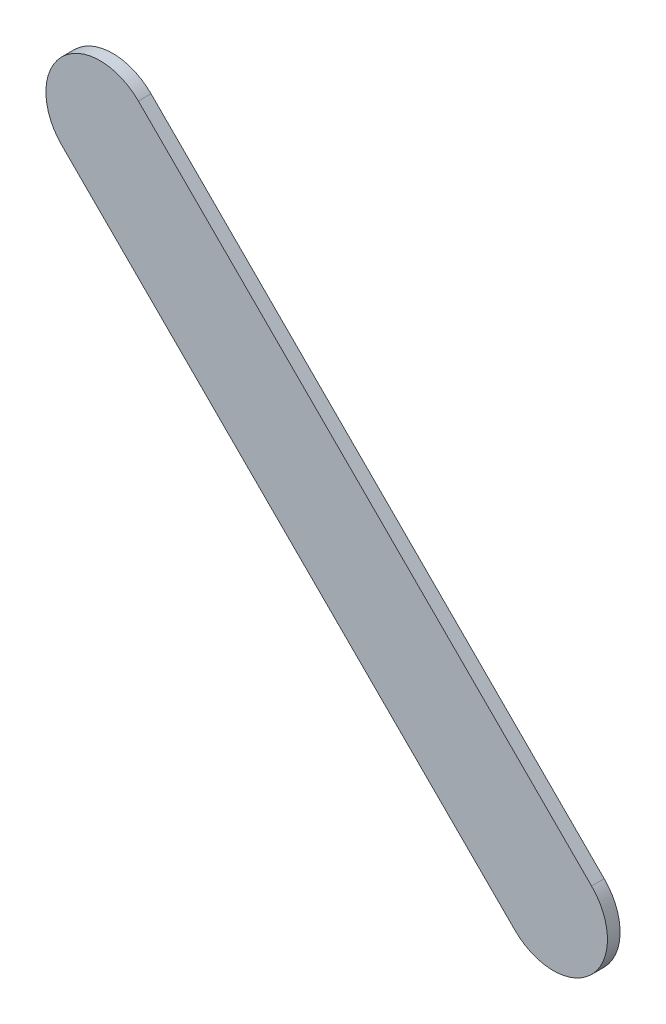
ISO-10303-21;
HEADER;
FILE_DESCRIPTION(('STEP AP214'),'2;1');
FILE_NAME('part.step','',(''),(''),'','','');
FILE_SCHEMA(('AUTOMOTIVE_DESIGN { 1 0 10303 214 1 1 1 1 }'));
ENDSEC;
DATA;
#1=APPLICATION_CONTEXT('core data for automotive mechanical design processes');
#2=APPLICATION_PROTOCOL_DEFINITION('international standard','automotive_design',2000,#1);
#3=PRODUCT_CONTEXT('',#1,'mechanical');
#4=PRODUCT('Part','Part','',(#3));
#5=PRODUCT_RELATED_PRODUCT_CATEGORY('part','',(#4));
#6=PRODUCT_DEFINITION_FORMATION('','',#4);
#7=PRODUCT_DEFINITION_CONTEXT('part definition',#1,'design');
#8=PRODUCT_DEFINITION('design','',#6,#7);
#9=PRODUCT_DEFINITION_SHAPE('','',#8);
#10=(LENGTH_UNIT() NAMED_UNIT(*) SI_UNIT(.MILLI.,.METRE.));
#11=(NAMED_UNIT(*) PLANE_ANGLE_UNIT() SI_UNIT($,.RADIAN.));
#12=(NAMED_UNIT(*) SI_UNIT($,.STERADIAN.) SOLID_ANGLE_UNIT());
#13=UNCERTAINTY_MEASURE_WITH_UNIT(LENGTH_MEASURE(1.E-05),#10,'distance_accuracy_value','');
#14=(GEOMETRIC_REPRESENTATION_CONTEXT(3) GLOBAL_UNCERTAINTY_ASSIGNED_CONTEXT((#13)) GLOBAL_UNIT_ASSIGNED_CONTEXT((#10,
#11,#12)) REPRESENTATION_CONTEXT('',''));
#15=CARTESIAN_POINT('',(0.,0.,0.));
#16=DIRECTION('',(0.,0.,1.));
#17=DIRECTION('',(1.,0.,0.));
#18=AXIS2_PLACEMENT_3D('',#15,#16,#17);
#19=CARTESIAN_POINT('',(94.271066,-123.223933,1.635));
#20=DIRECTION('',(0.,0.,1.));
#21=DIRECTION('',(1.,0.,0.));
#22=AXIS2_PLACEMENT_3D('',#19,#20,#21);
#23=PLANE('',#22);
#24=DIRECTION('',(-0.707106781186548,0.707106781186548,0.));
#25=VECTOR('',#24,1.);
#26=CARTESIAN_POINT('',(94.271066,-123.223933,1.635));
#27=LINE('',#26,#25);
#28=CARTESIAN_POINT('',(94.271066,-123.223933,1.635));
#29=VERTEX_POINT('',#28);
#30=CARTESIAN_POINT('',(93.016066,-121.968933,1.635));
#31=VERTEX_POINT('',#30);
#32=EDGE_CURVE('E99',#29,#31,#27,.T.);
#33=ORIENTED_EDGE('',*,*,#32,.T.);
#34=CARTESIAN_POINT('',(92.9099995,-122.0749995,1.635));
#35=DIRECTION('',(0.,0.,1.));
#36=DIRECTION('',(0.707106781186548,0.707106781186548,0.));
#37=AXIS2_PLACEMENT_3D('',#34,#35,#36);
#38=CIRCLE('',#37,0.150000682813);
#39=CARTESIAN_POINT('',(92.803933,-122.181066,1.635));
#40=VERTEX_POINT('',#39);
#41=EDGE_CURVE('E78',#31,#40,#38,.T.);
#42=ORIENTED_EDGE('',*,*,#41,.T.);
#43=DIRECTION('',(0.707106781186548,-0.707106781186548,0.));
#44=VECTOR('',#43,1.);
#45=CARTESIAN_POINT('',(92.803933,-122.181066,1.635));
#46=LINE('',#45,#44);
#47=CARTESIAN_POINT('',(94.058933,-123.436066,1.635));
#48=VERTEX_POINT('',#47);
#49=EDGE_CURVE('E83',#40,#48,#46,.T.);
#50=ORIENTED_EDGE('',*,*,#49,.T.);
#51=CARTESIAN_POINT('',(94.1649995,-123.3299995,1.635));
#52=DIRECTION('',(0.,0.,1.));
#53=DIRECTION('',(-0.707106781186548,-0.707106781186548,0.));
#54=AXIS2_PLACEMENT_3D('',#51,#52,#53);
#55=CIRCLE('',#54,0.150000682813);
#56=EDGE_CURVE('E11',#48,#29,#55,.T.);
#57=ORIENTED_EDGE('',*,*,#56,.T.);
#58=EDGE_LOOP('',(#33,#42,#50,#57));
#59=FACE_BOUND('',#58,.T.);
#60=ADVANCED_FACE('F17',(#59),#23,.T.);
#61=CARTESIAN_POINT('',(94.271066,-123.223933,1.6));
#62=DIRECTION('',(0.,0.,1.));
#63=DIRECTION('',(1.,0.,0.));
#64=AXIS2_PLACEMENT_3D('',#61,#62,#63);
#65=PLANE('',#64);
#66=CARTESIAN_POINT('',(94.1649995,-123.3299995,1.6));
#67=DIRECTION('',(0.,0.,1.));
#68=DIRECTION('',(-0.707106781186548,-0.707106781186548,0.));
#69=AXIS2_PLACEMENT_3D('',#66,#67,#68);
#70=CIRCLE('',#69,0.150000682813);
#71=CARTESIAN_POINT('',(94.058933,-123.436066,1.6));
#72=VERTEX_POINT('',#71);
#73=CARTESIAN_POINT('',(94.271066,-123.223933,1.6));
#74=VERTEX_POINT('',#73);
#75=EDGE_CURVE('E20',#72,#74,#70,.T.);
#76=ORIENTED_EDGE('',*,*,#75,.F.);
#77=DIRECTION('',(0.707106781186548,-0.707106781186548,0.));
#78=VECTOR('',#77,1.);
#79=CARTESIAN_POINT('',(92.803933,-122.181066,1.6));
#80=LINE('',#79,#78);
#81=CARTESIAN_POINT('',(92.803933,-122.181066,1.6));
#82=VERTEX_POINT('',#81);
#83=EDGE_CURVE('E68',#82,#72,#80,.T.);
#84=ORIENTED_EDGE('',*,*,#83,.F.);
#85=CARTESIAN_POINT('',(92.9099995,-122.0749995,1.6));
#86=DIRECTION('',(0.,0.,1.));
#87=DIRECTION('',(0.707106781186548,0.707106781186548,0.));
#88=AXIS2_PLACEMENT_3D('',#85,#86,#87);
#89=CIRCLE('',#88,0.150000682813);
#90=CARTESIAN_POINT('',(93.016066,-121.968933,1.6));
#91=VERTEX_POINT('',#90);
#92=EDGE_CURVE('E72',#91,#82,#89,.T.);
#93=ORIENTED_EDGE('',*,*,#92,.F.);
#94=DIRECTION('',(-0.707106781186548,0.707106781186548,0.));
#95=VECTOR('',#94,1.);
#96=CARTESIAN_POINT('',(94.271066,-123.223933,1.6));
#97=LINE('',#96,#95);
#98=EDGE_CURVE('E122',#74,#91,#97,.T.);
#99=ORIENTED_EDGE('',*,*,#98,.F.);
#100=EDGE_LOOP('',(#76,#84,#93,#99));
#101=FACE_BOUND('',#100,.T.);
#102=ADVANCED_FACE('F70',(#101),#65,.F.);
#103=CARTESIAN_POINT('',(94.1649995,-123.3299995,1.6));
#104=DIRECTION('',(0.,0.,-1.));
#105=DIRECTION('',(-0.707106781186548,-0.707106781186548,0.));
#106=AXIS2_PLACEMENT_3D('',#103,#104,#105);
#107=CYLINDRICAL_SURFACE('',#106,0.150000682813);
#108=ORIENTED_EDGE('',*,*,#75,.T.);
#109=DIRECTION('',(0.,0.,1.));
#110=VECTOR('',#109,1.);
#111=CARTESIAN_POINT('',(94.271066,-123.223933,1.6));
#112=LINE('',#111,#110);
#113=EDGE_CURVE('E93',#74,#29,#112,.T.);
#114=ORIENTED_EDGE('',*,*,#113,.T.);
#115=ORIENTED_EDGE('',*,*,#56,.F.);
#116=DIRECTION('',(0.,0.,1.));
#117=VECTOR('',#116,1.);
#118=CARTESIAN_POINT('',(94.058933,-123.436066,1.6));
#119=LINE('',#118,#117);
#120=EDGE_CURVE('E77',#72,#48,#119,.T.);
#121=ORIENTED_EDGE('',*,*,#120,.F.);
#122=EDGE_LOOP('',(#108,#114,#115,#121));
#123=FACE_BOUND('',#122,.T.);
#124=ADVANCED_FACE('F118',(#123),#107,.T.);
#125=CARTESIAN_POINT('',(92.803933,-122.181066,1.6));
#126=DIRECTION('',(0.707106781186548,0.707106781186548,0.));
#127=DIRECTION('',(0.,0.,-1.));
#128=AXIS2_PLACEMENT_3D('',#125,#126,#127);
#129=PLANE('',#128);
#130=ORIENTED_EDGE('',*,*,#83,.T.);
#131=ORIENTED_EDGE('',*,*,#120,.T.);
#132=ORIENTED_EDGE('',*,*,#49,.F.);
#133=DIRECTION('',(0.,0.,1.));
#134=VECTOR('',#133,1.);
#135=CARTESIAN_POINT('',(92.803933,-122.181066,1.6));
#136=LINE('',#135,#134);
#137=EDGE_CURVE('E81',#82,#40,#136,.T.);
#138=ORIENTED_EDGE('',*,*,#137,.F.);
#139=EDGE_LOOP('',(#130,#131,#132,#138));
#140=FACE_BOUND('',#139,.T.);
#141=ADVANCED_FACE('F82',(#140),#129,.F.);
#142=CARTESIAN_POINT('',(92.9099995,-122.0749995,1.6));
#143=DIRECTION('',(0.,0.,-1.));
#144=DIRECTION('',(0.707106781186548,0.707106781186548,0.));
#145=AXIS2_PLACEMENT_3D('',#142,#143,#144);
#146=CYLINDRICAL_SURFACE('',#145,0.150000682813);
#147=ORIENTED_EDGE('',*,*,#92,.T.);
#148=ORIENTED_EDGE('',*,*,#137,.T.);
#149=ORIENTED_EDGE('',*,*,#41,.F.);
#150=DIRECTION('',(0.,0.,1.));
#151=VECTOR('',#150,1.);
#152=CARTESIAN_POINT('',(93.016066,-121.968933,1.6));
#153=LINE('',#152,#151);
#154=EDGE_CURVE('E90',#91,#31,#153,.T.);
#155=ORIENTED_EDGE('',*,*,#154,.F.);
#156=EDGE_LOOP('',(#147,#148,#149,#155));
#157=FACE_BOUND('',#156,.T.);
#158=ADVANCED_FACE('F88',(#157),#146,.T.);
#159=CARTESIAN_POINT('',(94.271066,-123.223933,1.6));
#160=DIRECTION('',(-0.707106781186548,-0.707106781186548,0.));
#161=DIRECTION('',(-0.707106781186548,0.707106781186548,0.));
#162=AXIS2_PLACEMENT_3D('',#159,#160,#161);
#163=PLANE('',#162);
#164=ORIENTED_EDGE('',*,*,#98,.T.);
#165=ORIENTED_EDGE('',*,*,#154,.T.);
#166=ORIENTED_EDGE('',*,*,#32,.F.);
#167=ORIENTED_EDGE('',*,*,#113,.F.);
#168=EDGE_LOOP('',(#164,#165,#166,#167));
#169=FACE_BOUND('',#168,.T.);
#170=ADVANCED_FACE('F121',(#169),#163,.F.);
#171=CLOSED_SHELL('',(#60,#102,#124,#141,#158,#170));
#172=MANIFOLD_SOLID_BREP('B1',#171);
#173=ADVANCED_BREP_SHAPE_REPRESENTATION('',(#18,#172),#14);
#174=SHAPE_DEFINITION_REPRESENTATION(#9,#173);
ENDSEC;
END-ISO-10303-21;
